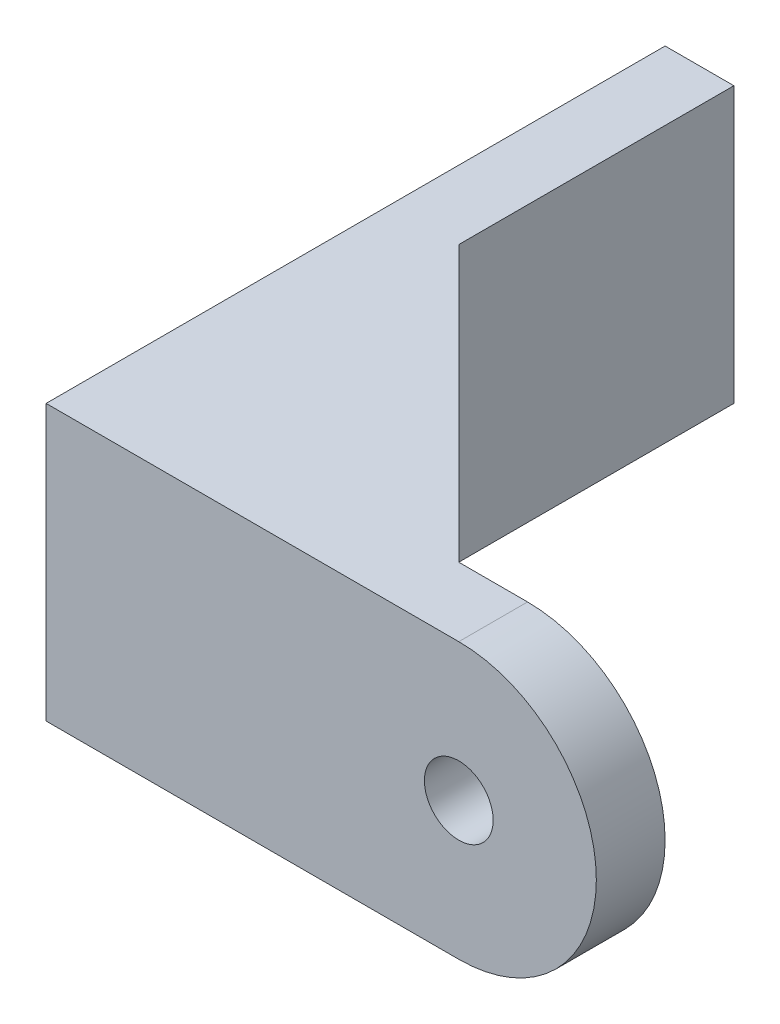
ISO-10303-21;
HEADER;
FILE_DESCRIPTION(('STEP AP214'),'2;1');
FILE_NAME('part.step','',(''),(''),'','','');
FILE_SCHEMA(('AUTOMOTIVE_DESIGN { 1 0 10303 214 1 1 1 1 }'));
ENDSEC;
DATA;
#1=APPLICATION_CONTEXT('core data for automotive mechanical design processes');
#2=APPLICATION_PROTOCOL_DEFINITION('international standard','automotive_design',2000,#1);
#3=PRODUCT_CONTEXT('',#1,'mechanical');
#4=PRODUCT('Part','Part','',(#3));
#5=PRODUCT_RELATED_PRODUCT_CATEGORY('part','',(#4));
#6=PRODUCT_DEFINITION_FORMATION('','',#4);
#7=PRODUCT_DEFINITION_CONTEXT('part definition',#1,'design');
#8=PRODUCT_DEFINITION('design','',#6,#7);
#9=PRODUCT_DEFINITION_SHAPE('','',#8);
#10=(LENGTH_UNIT() NAMED_UNIT(*) SI_UNIT(.MILLI.,.METRE.));
#11=(NAMED_UNIT(*) PLANE_ANGLE_UNIT() SI_UNIT($,.RADIAN.));
#12=(NAMED_UNIT(*) SI_UNIT($,.STERADIAN.) SOLID_ANGLE_UNIT());
#13=UNCERTAINTY_MEASURE_WITH_UNIT(LENGTH_MEASURE(1.E-05),#10,'distance_accuracy_value','');
#14=(GEOMETRIC_REPRESENTATION_CONTEXT(3) GLOBAL_UNCERTAINTY_ASSIGNED_CONTEXT((#13)) GLOBAL_UNIT_ASSIGNED_CONTEXT((#10,
#11,#12)) REPRESENTATION_CONTEXT('',''));
#15=CARTESIAN_POINT('',(0.,0.,0.));
#16=DIRECTION('',(0.,0.,1.));
#17=DIRECTION('',(1.,0.,0.));
#18=AXIS2_PLACEMENT_3D('',#15,#16,#17);
#19=CARTESIAN_POINT('',(0.,0.,0.));
#20=DIRECTION('',(0.,0.,1.));
#21=DIRECTION('',(1.,0.,0.));
#22=AXIS2_PLACEMENT_3D('',#19,#20,#21);
#23=PLANE('',#22);
#24=CARTESIAN_POINT('',(15.,0.,0.));
#25=DIRECTION('',(0.,0.,1.));
#26=DIRECTION('',(1.,0.,0.));
#27=AXIS2_PLACEMENT_3D('',#24,#25,#26);
#28=CIRCLE('',#27,2.5);
#29=CARTESIAN_POINT('',(17.5,0.,0.));
#30=VERTEX_POINT('',#29);
#31=EDGE_CURVE('E179',#30,#30,#28,.T.);
#32=ORIENTED_EDGE('',*,*,#31,.T.);
#33=EDGE_LOOP('',(#32));
#34=FACE_BOUND('',#33,.T.);
#35=DIRECTION('',(1.,0.,0.));
#36=VECTOR('',#35,1.);
#37=CARTESIAN_POINT('',(-9.99999999999999,5.,0.));
#38=LINE('',#37,#36);
#39=CARTESIAN_POINT('',(-9.99999999999999,5.,0.));
#40=VERTEX_POINT('',#39);
#41=CARTESIAN_POINT('',(10.,5.,0.));
#42=VERTEX_POINT('',#41);
#43=EDGE_CURVE('E57',#40,#42,#38,.T.);
#44=ORIENTED_EDGE('',*,*,#43,.T.);
#45=DIRECTION('',(0.,1.,0.));
#46=VECTOR('',#45,1.);
#47=CARTESIAN_POINT('',(10.,5.,0.));
#48=LINE('',#47,#46);
#49=CARTESIAN_POINT('',(10.,10.,0.));
#50=VERTEX_POINT('',#49);
#51=EDGE_CURVE('E224',#42,#50,#48,.T.);
#52=ORIENTED_EDGE('',*,*,#51,.T.);
#53=DIRECTION('',(1.,0.,0.));
#54=VECTOR('',#53,1.);
#55=CARTESIAN_POINT('',(0.,10.,0.));
#56=LINE('',#55,#54);
#57=CARTESIAN_POINT('',(15.,10.,0.));
#58=VERTEX_POINT('',#57);
#59=EDGE_CURVE('E201',#50,#58,#56,.T.);
#60=ORIENTED_EDGE('',*,*,#59,.T.);
#61=CARTESIAN_POINT('',(15.,0.,0.));
#62=DIRECTION('',(0.,0.,1.));
#63=DIRECTION('',(1.,0.,0.));
#64=AXIS2_PLACEMENT_3D('',#61,#62,#63);
#65=CIRCLE('',#64,10.);
#66=CARTESIAN_POINT('',(15.,-10.,0.));
#67=VERTEX_POINT('',#66);
#68=EDGE_CURVE('E198',#58,#67,#65,.F.);
#69=ORIENTED_EDGE('',*,*,#68,.T.);
#70=DIRECTION('',(1.,0.,0.));
#71=VECTOR('',#70,1.);
#72=CARTESIAN_POINT('',(0.,-10.,0.));
#73=LINE('',#72,#71);
#74=CARTESIAN_POINT('',(10.,-10.,0.));
#75=VERTEX_POINT('',#74);
#76=EDGE_CURVE('E141',#75,#67,#73,.T.);
#77=ORIENTED_EDGE('',*,*,#76,.F.);
#78=DIRECTION('',(0.,-1.,0.));
#79=VECTOR('',#78,1.);
#80=CARTESIAN_POINT('',(10.,-5.,0.));
#81=LINE('',#80,#79);
#82=CARTESIAN_POINT('',(10.,-5.,0.));
#83=VERTEX_POINT('',#82);
#84=EDGE_CURVE('E132',#83,#75,#81,.T.);
#85=ORIENTED_EDGE('',*,*,#84,.F.);
#86=DIRECTION('',(1.,0.,0.));
#87=VECTOR('',#86,1.);
#88=CARTESIAN_POINT('',(0.,-5.,0.));
#89=LINE('',#88,#87);
#90=CARTESIAN_POINT('',(-9.99999999999999,-5.,0.));
#91=VERTEX_POINT('',#90);
#92=EDGE_CURVE('E120',#91,#83,#89,.T.);
#93=ORIENTED_EDGE('',*,*,#92,.F.);
#94=DIRECTION('',(0.,-1.,0.));
#95=VECTOR('',#94,1.);
#96=CARTESIAN_POINT('',(-9.99999999999999,0.,0.));
#97=LINE('',#96,#95);
#98=EDGE_CURVE('E146',#40,#91,#97,.T.);
#99=ORIENTED_EDGE('',*,*,#98,.F.);
#100=EDGE_LOOP('',(#44,#52,#60,#69,#77,#85,#93,#99));
#101=FACE_BOUND('',#100,.T.);
#102=ADVANCED_FACE('F41',(#34,#101),#23,.F.);
#103=CARTESIAN_POINT('',(-9.99999999999999,0.,-40.));
#104=DIRECTION('',(-1.,0.,0.));
#105=DIRECTION('',(0.,-1.,0.));
#106=AXIS2_PLACEMENT_3D('',#103,#104,#105);
#107=PLANE('',#106);
#108=DIRECTION('',(0.,0.,1.));
#109=VECTOR('',#108,1.);
#110=CARTESIAN_POINT('',(-9.99999999999999,10.,-40.));
#111=LINE('',#110,#109);
#112=CARTESIAN_POINT('',(-9.99999999999999,10.,-40.));
#113=VERTEX_POINT('',#112);
#114=CARTESIAN_POINT('',(-10.,10.,-19.9999999999998));
#115=VERTEX_POINT('',#114);
#116=EDGE_CURVE('E172',#113,#115,#111,.T.);
#117=ORIENTED_EDGE('',*,*,#116,.T.);
#118=DIRECTION('',(0.,1.,0.));
#119=VECTOR('',#118,1.);
#120=CARTESIAN_POINT('',(-10.,5.,-19.9999999999998));
#121=LINE('',#120,#119);
#122=CARTESIAN_POINT('',(-9.99999999999999,5.,-19.9999999999998));
#123=VERTEX_POINT('',#122);
#124=EDGE_CURVE('E65',#123,#115,#121,.T.);
#125=ORIENTED_EDGE('',*,*,#124,.F.);
#126=DIRECTION('',(0.,0.,1.));
#127=VECTOR('',#126,1.);
#128=CARTESIAN_POINT('',(-10.,5.,-19.9999999999998));
#129=LINE('',#128,#127);
#130=EDGE_CURVE('E228',#123,#40,#129,.T.);
#131=ORIENTED_EDGE('',*,*,#130,.T.);
#132=ORIENTED_EDGE('',*,*,#98,.T.);
#133=DIRECTION('',(0.,0.,1.));
#134=VECTOR('',#133,1.);
#135=CARTESIAN_POINT('',(-9.99999999999999,-5.,0.));
#136=LINE('',#135,#134);
#137=CARTESIAN_POINT('',(-10.,-5.,-19.9999999999998));
#138=VERTEX_POINT('',#137);
#139=EDGE_CURVE('E126',#138,#91,#136,.T.);
#140=ORIENTED_EDGE('',*,*,#139,.F.);
#141=DIRECTION('',(0.,-1.,0.));
#142=VECTOR('',#141,1.);
#143=CARTESIAN_POINT('',(-10.,-5.,-19.9999999999998));
#144=LINE('',#143,#142);
#145=CARTESIAN_POINT('',(-10.,-10.,-19.9999999999998));
#146=VERTEX_POINT('',#145);
#147=EDGE_CURVE('E135',#138,#146,#144,.T.);
#148=ORIENTED_EDGE('',*,*,#147,.T.);
#149=DIRECTION('',(0.,0.,1.));
#150=VECTOR('',#149,1.);
#151=CARTESIAN_POINT('',(-9.99999999999999,-10.,-40.));
#152=LINE('',#151,#150);
#153=CARTESIAN_POINT('',(-9.99999999999999,-10.,-40.));
#154=VERTEX_POINT('',#153);
#155=EDGE_CURVE('E166',#154,#146,#152,.T.);
#156=ORIENTED_EDGE('',*,*,#155,.F.);
#157=DIRECTION('',(0.,-1.,0.));
#158=VECTOR('',#157,1.);
#159=CARTESIAN_POINT('',(-9.99999999999999,0.,-40.));
#160=LINE('',#159,#158);
#161=EDGE_CURVE('E155',#113,#154,#160,.T.);
#162=ORIENTED_EDGE('',*,*,#161,.F.);
#163=EDGE_LOOP('',(#117,#125,#131,#132,#140,#148,#156,#162));
#164=FACE_BOUND('',#163,.T.);
#165=ADVANCED_FACE('F239',(#164),#107,.F.);
#166=CARTESIAN_POINT('',(0.,-10.,5.));
#167=DIRECTION('',(0.,1.,0.));
#168=DIRECTION('',(0.,0.,1.));
#169=AXIS2_PLACEMENT_3D('',#166,#167,#168);
#170=PLANE('',#169);
#171=DIRECTION('',(-0.707106781186551,0.,-0.707106781186544));
#172=VECTOR('',#171,1.);
#173=CARTESIAN_POINT('',(4.99999999999995,-10.,-5.));
#174=LINE('',#173,#172);
#175=EDGE_CURVE('E137',#75,#146,#174,.T.);
#176=ORIENTED_EDGE('',*,*,#175,.F.);
#177=ORIENTED_EDGE('',*,*,#76,.T.);
#178=DIRECTION('',(0.,0.,-1.));
#179=VECTOR('',#178,1.);
#180=CARTESIAN_POINT('',(15.,-10.,5.));
#181=LINE('',#180,#179);
#182=CARTESIAN_POINT('',(15.,-10.,5.));
#183=VERTEX_POINT('',#182);
#184=EDGE_CURVE('E11',#183,#67,#181,.T.);
#185=ORIENTED_EDGE('',*,*,#184,.F.);
#186=DIRECTION('',(1.,0.,0.));
#187=VECTOR('',#186,1.);
#188=CARTESIAN_POINT('',(0.,-10.,5.));
#189=LINE('',#188,#187);
#190=CARTESIAN_POINT('',(-15.,-10.,5.));
#191=VERTEX_POINT('',#190);
#192=EDGE_CURVE('E175',#191,#183,#189,.T.);
#193=ORIENTED_EDGE('',*,*,#192,.F.);
#194=DIRECTION('',(0.,0.,-1.));
#195=VECTOR('',#194,1.);
#196=CARTESIAN_POINT('',(-15.,-10.,5.));
#197=LINE('',#196,#195);
#198=CARTESIAN_POINT('',(-15.,-10.,-40.));
#199=VERTEX_POINT('',#198);
#200=EDGE_CURVE('E195',#191,#199,#197,.T.);
#201=ORIENTED_EDGE('',*,*,#200,.T.);
#202=DIRECTION('',(-1.,0.,0.));
#203=VECTOR('',#202,1.);
#204=CARTESIAN_POINT('',(0.,-10.,-40.));
#205=LINE('',#204,#203);
#206=EDGE_CURVE('E158',#154,#199,#205,.T.);
#207=ORIENTED_EDGE('',*,*,#206,.F.);
#208=ORIENTED_EDGE('',*,*,#155,.T.);
#209=EDGE_LOOP('',(#176,#177,#185,#193,#201,#207,#208));
#210=FACE_BOUND('',#209,.T.);
#211=ADVANCED_FACE('F43',(#210),#170,.F.);
#212=CARTESIAN_POINT('',(15.,0.,5.));
#213=DIRECTION('',(0.,0.,-1.));
#214=DIRECTION('',(-1.,0.,0.));
#215=AXIS2_PLACEMENT_3D('',#212,#213,#214);
#216=CYLINDRICAL_SURFACE('',#215,10.);
#217=ORIENTED_EDGE('',*,*,#68,.F.);
#218=DIRECTION('',(0.,0.,-1.));
#219=VECTOR('',#218,1.);
#220=CARTESIAN_POINT('',(15.,10.,5.));
#221=LINE('',#220,#219);
#222=CARTESIAN_POINT('',(15.,10.,5.));
#223=VERTEX_POINT('',#222);
#224=EDGE_CURVE('E50',#223,#58,#221,.T.);
#225=ORIENTED_EDGE('',*,*,#224,.F.);
#226=CARTESIAN_POINT('',(15.,0.,5.));
#227=DIRECTION('',(0.,0.,1.));
#228=DIRECTION('',(1.,0.,0.));
#229=AXIS2_PLACEMENT_3D('',#226,#227,#228);
#230=CIRCLE('',#229,10.);
#231=EDGE_CURVE('E178',#223,#183,#230,.F.);
#232=ORIENTED_EDGE('',*,*,#231,.T.);
#233=ORIENTED_EDGE('',*,*,#184,.T.);
#234=EDGE_LOOP('',(#217,#225,#232,#233));
#235=FACE_BOUND('',#234,.T.);
#236=ADVANCED_FACE('F222',(#235),#216,.T.);
#237=CARTESIAN_POINT('',(0.,10.,5.));
#238=DIRECTION('',(0.,1.,0.));
#239=DIRECTION('',(0.,0.,1.));
#240=AXIS2_PLACEMENT_3D('',#237,#238,#239);
#241=PLANE('',#240);
#242=ORIENTED_EDGE('',*,*,#59,.F.);
#243=DIRECTION('',(-0.707106781186551,0.,-0.707106781186544));
#244=VECTOR('',#243,1.);
#245=CARTESIAN_POINT('',(10.,10.,0.));
#246=LINE('',#245,#244);
#247=EDGE_CURVE('E390',#50,#115,#246,.T.);
#248=ORIENTED_EDGE('',*,*,#247,.T.);
#249=ORIENTED_EDGE('',*,*,#116,.F.);
#250=DIRECTION('',(1.,0.,0.));
#251=VECTOR('',#250,1.);
#252=CARTESIAN_POINT('',(0.,10.,-40.));
#253=LINE('',#252,#251);
#254=CARTESIAN_POINT('',(-15.,10.,-40.));
#255=VERTEX_POINT('',#254);
#256=EDGE_CURVE('E151',#255,#113,#253,.T.);
#257=ORIENTED_EDGE('',*,*,#256,.F.);
#258=DIRECTION('',(0.,0.,-1.));
#259=VECTOR('',#258,1.);
#260=CARTESIAN_POINT('',(-15.,10.,5.));
#261=LINE('',#260,#259);
#262=CARTESIAN_POINT('',(-15.,10.,5.));
#263=VERTEX_POINT('',#262);
#264=EDGE_CURVE('E209',#263,#255,#261,.T.);
#265=ORIENTED_EDGE('',*,*,#264,.F.);
#266=DIRECTION('',(1.,0.,0.));
#267=VECTOR('',#266,1.);
#268=CARTESIAN_POINT('',(0.,10.,5.));
#269=LINE('',#268,#267);
#270=EDGE_CURVE('E183',#263,#223,#269,.T.);
#271=ORIENTED_EDGE('',*,*,#270,.T.);
#272=ORIENTED_EDGE('',*,*,#224,.T.);
#273=EDGE_LOOP('',(#242,#248,#249,#257,#265,#271,#272));
#274=FACE_BOUND('',#273,.T.);
#275=ADVANCED_FACE('F216',(#274),#241,.T.);
#276=CARTESIAN_POINT('',(-15.,0.,5.));
#277=DIRECTION('',(-1.,0.,0.));
#278=DIRECTION('',(0.,0.,1.));
#279=AXIS2_PLACEMENT_3D('',#276,#277,#278);
#280=PLANE('',#279);
#281=ORIENTED_EDGE('',*,*,#264,.T.);
#282=DIRECTION('',(0.,1.,0.));
#283=VECTOR('',#282,1.);
#284=CARTESIAN_POINT('',(-15.,0.,-40.));
#285=LINE('',#284,#283);
#286=EDGE_CURVE('E162',#199,#255,#285,.T.);
#287=ORIENTED_EDGE('',*,*,#286,.F.);
#288=ORIENTED_EDGE('',*,*,#200,.F.);
#289=DIRECTION('',(0.,1.,0.));
#290=VECTOR('',#289,1.);
#291=CARTESIAN_POINT('',(-15.,0.,5.));
#292=LINE('',#291,#290);
#293=EDGE_CURVE('E187',#191,#263,#292,.T.);
#294=ORIENTED_EDGE('',*,*,#293,.T.);
#295=EDGE_LOOP('',(#281,#287,#288,#294));
#296=FACE_BOUND('',#295,.T.);
#297=ADVANCED_FACE('F247',(#296),#280,.T.);
#298=CARTESIAN_POINT('',(15.,0.,5.));
#299=DIRECTION('',(0.,0.,-1.));
#300=DIRECTION('',(-1.,0.,0.));
#301=AXIS2_PLACEMENT_3D('',#298,#299,#300);
#302=CYLINDRICAL_SURFACE('',#301,2.5);
#303=CARTESIAN_POINT('',(15.,0.,5.));
#304=DIRECTION('',(0.,0.,1.));
#305=DIRECTION('',(1.,0.,0.));
#306=AXIS2_PLACEMENT_3D('',#303,#304,#305);
#307=CIRCLE('',#306,2.5);
#308=CARTESIAN_POINT('',(17.5,0.,5.));
#309=VERTEX_POINT('',#308);
#310=EDGE_CURVE('E191',#309,#309,#307,.T.);
#311=ORIENTED_EDGE('',*,*,#310,.T.);
#312=EDGE_LOOP('',(#311));
#313=FACE_BOUND('',#312,.T.);
#314=ORIENTED_EDGE('',*,*,#31,.F.);
#315=EDGE_LOOP('',(#314));
#316=FACE_BOUND('',#315,.T.);
#317=ADVANCED_FACE('F254',(#313,#316),#302,.F.);
#318=CARTESIAN_POINT('',(0.,0.,5.));
#319=DIRECTION('',(0.,0.,1.));
#320=DIRECTION('',(1.,0.,0.));
#321=AXIS2_PLACEMENT_3D('',#318,#319,#320);
#322=PLANE('',#321);
#323=ORIENTED_EDGE('',*,*,#192,.T.);
#324=ORIENTED_EDGE('',*,*,#231,.F.);
#325=ORIENTED_EDGE('',*,*,#270,.F.);
#326=ORIENTED_EDGE('',*,*,#293,.F.);
#327=EDGE_LOOP('',(#323,#324,#325,#326));
#328=FACE_BOUND('',#327,.T.);
#329=ORIENTED_EDGE('',*,*,#310,.F.);
#330=EDGE_LOOP('',(#329));
#331=FACE_BOUND('',#330,.T.);
#332=ADVANCED_FACE('F251',(#328,#331),#322,.T.);
#333=CARTESIAN_POINT('',(0.,0.,-40.));
#334=DIRECTION('',(0.,0.,-1.));
#335=DIRECTION('',(-1.,0.,0.));
#336=AXIS2_PLACEMENT_3D('',#333,#334,#335);
#337=PLANE('',#336);
#338=ORIENTED_EDGE('',*,*,#256,.T.);
#339=ORIENTED_EDGE('',*,*,#161,.T.);
#340=ORIENTED_EDGE('',*,*,#206,.T.);
#341=ORIENTED_EDGE('',*,*,#286,.T.);
#342=EDGE_LOOP('',(#338,#339,#340,#341));
#343=FACE_BOUND('',#342,.T.);
#344=ADVANCED_FACE('F244',(#343),#337,.T.);
#345=CARTESIAN_POINT('',(4.99999999999995,-5.,-5.));
#346=DIRECTION('',(-0.707106781186544,0.,0.707106781186551));
#347=DIRECTION('',(0.707106781186551,0.,0.707106781186544));
#348=AXIS2_PLACEMENT_3D('',#345,#346,#347);
#349=PLANE('',#348);
#350=ORIENTED_EDGE('',*,*,#175,.T.);
#351=ORIENTED_EDGE('',*,*,#147,.F.);
#352=DIRECTION('',(-0.707106781186551,0.,-0.707106781186544));
#353=VECTOR('',#352,1.);
#354=CARTESIAN_POINT('',(4.99999999999995,-5.,-5.));
#355=LINE('',#354,#353);
#356=EDGE_CURVE('E123',#83,#138,#355,.T.);
#357=ORIENTED_EDGE('',*,*,#356,.F.);
#358=ORIENTED_EDGE('',*,*,#84,.T.);
#359=EDGE_LOOP('',(#350,#351,#357,#358));
#360=FACE_BOUND('',#359,.T.);
#361=ADVANCED_FACE('F131',(#360),#349,.F.);
#362=CARTESIAN_POINT('',(0.,-5.,0.));
#363=DIRECTION('',(0.,-1.,0.));
#364=DIRECTION('',(0.,0.,-1.));
#365=AXIS2_PLACEMENT_3D('',#362,#363,#364);
#366=PLANE('',#365);
#367=ORIENTED_EDGE('',*,*,#356,.T.);
#368=ORIENTED_EDGE('',*,*,#139,.T.);
#369=ORIENTED_EDGE('',*,*,#92,.T.);
#370=EDGE_LOOP('',(#367,#368,#369));
#371=FACE_BOUND('',#370,.T.);
#372=ADVANCED_FACE('F122',(#371),#366,.F.);
#373=CARTESIAN_POINT('',(10.,5.,0.));
#374=DIRECTION('',(0.707106781186544,0.,-0.707106781186551));
#375=DIRECTION('',(-0.707106781186551,0.,-0.707106781186544));
#376=AXIS2_PLACEMENT_3D('',#373,#374,#375);
#377=PLANE('',#376);
#378=ORIENTED_EDGE('',*,*,#247,.F.);
#379=ORIENTED_EDGE('',*,*,#51,.F.);
#380=DIRECTION('',(-0.707106781186551,0.,-0.707106781186544));
#381=VECTOR('',#380,1.);
#382=CARTESIAN_POINT('',(10.,5.,0.));
#383=LINE('',#382,#381);
#384=EDGE_CURVE('E233',#42,#123,#383,.T.);
#385=ORIENTED_EDGE('',*,*,#384,.T.);
#386=ORIENTED_EDGE('',*,*,#124,.T.);
#387=EDGE_LOOP('',(#378,#379,#385,#386));
#388=FACE_BOUND('',#387,.T.);
#389=ADVANCED_FACE('F303',(#388),#377,.T.);
#390=CARTESIAN_POINT('',(0.,5.,0.));
#391=DIRECTION('',(0.,-1.,0.));
#392=DIRECTION('',(0.,0.,-1.));
#393=AXIS2_PLACEMENT_3D('',#390,#391,#392);
#394=PLANE('',#393);
#395=ORIENTED_EDGE('',*,*,#43,.F.);
#396=ORIENTED_EDGE('',*,*,#130,.F.);
#397=ORIENTED_EDGE('',*,*,#384,.F.);
#398=EDGE_LOOP('',(#395,#396,#397));
#399=FACE_BOUND('',#398,.T.);
#400=ADVANCED_FACE('F307',(#399),#394,.T.);
#401=CLOSED_SHELL('',(#102,#165,#211,#236,#275,#297,#317,#332,#344,#361,#372,#389,#400));
#402=MANIFOLD_SOLID_BREP('B2',#401);
#403=ADVANCED_BREP_SHAPE_REPRESENTATION('',(#18,#402),#14);
#404=SHAPE_DEFINITION_REPRESENTATION(#9,#403);
ENDSEC;
END-ISO-10303-21;
